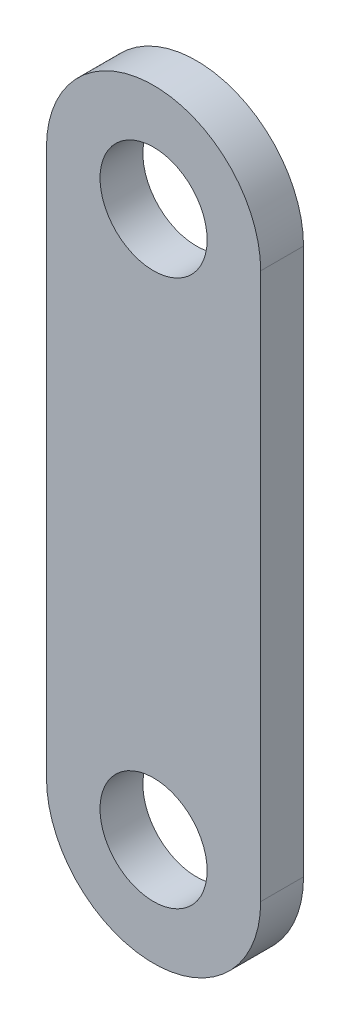
ISO-10303-21;
HEADER;
FILE_DESCRIPTION(('STEP AP214'),'2;1');
FILE_NAME('part.step','',(''),(''),'','','');
FILE_SCHEMA(('AUTOMOTIVE_DESIGN { 1 0 10303 214 1 1 1 1 }'));
ENDSEC;
DATA;
#1=APPLICATION_CONTEXT('core data for automotive mechanical design processes');
#2=APPLICATION_PROTOCOL_DEFINITION('international standard','automotive_design',2000,#1);
#3=PRODUCT_CONTEXT('',#1,'mechanical');
#4=PRODUCT('Part','Part','',(#3));
#5=PRODUCT_RELATED_PRODUCT_CATEGORY('part','',(#4));
#6=PRODUCT_DEFINITION_FORMATION('','',#4);
#7=PRODUCT_DEFINITION_CONTEXT('part definition',#1,'design');
#8=PRODUCT_DEFINITION('design','',#6,#7);
#9=PRODUCT_DEFINITION_SHAPE('','',#8);
#10=(LENGTH_UNIT() NAMED_UNIT(*) SI_UNIT(.MILLI.,.METRE.));
#11=(NAMED_UNIT(*) PLANE_ANGLE_UNIT() SI_UNIT($,.RADIAN.));
#12=(NAMED_UNIT(*) SI_UNIT($,.STERADIAN.) SOLID_ANGLE_UNIT());
#13=UNCERTAINTY_MEASURE_WITH_UNIT(LENGTH_MEASURE(1.E-05),#10,'distance_accuracy_value','');
#14=(GEOMETRIC_REPRESENTATION_CONTEXT(3) GLOBAL_UNCERTAINTY_ASSIGNED_CONTEXT((#13)) GLOBAL_UNIT_ASSIGNED_CONTEXT((#10,
#11,#12)) REPRESENTATION_CONTEXT('',''));
#15=CARTESIAN_POINT('',(0.,0.,0.));
#16=DIRECTION('',(0.,0.,1.));
#17=DIRECTION('',(1.,0.,0.));
#18=AXIS2_PLACEMENT_3D('',#15,#16,#17);
#19=CARTESIAN_POINT('',(-50.,0.,-10.));
#20=DIRECTION('',(1.,0.,0.));
#21=DIRECTION('',(0.,0.,-1.));
#22=AXIS2_PLACEMENT_3D('',#19,#20,#21);
#23=PLANE('',#22);
#24=DIRECTION('',(0.,0.,1.));
#25=VECTOR('',#24,1.);
#26=CARTESIAN_POINT('',(-50.,0.,-10.));
#27=LINE('',#26,#25);
#28=CARTESIAN_POINT('',(-50.,0.,-10.));
#29=VERTEX_POINT('',#28);
#30=CARTESIAN_POINT('',(-50.,0.,10.));
#31=VERTEX_POINT('',#30);
#32=EDGE_CURVE('E37',#29,#31,#27,.T.);
#33=ORIENTED_EDGE('',*,*,#32,.T.);
#34=DIRECTION('',(0.,1.,0.));
#35=VECTOR('',#34,1.);
#36=CARTESIAN_POINT('',(-50.,0.,10.));
#37=LINE('',#36,#35);
#38=CARTESIAN_POINT('',(-50.,255.,10.));
#39=VERTEX_POINT('',#38);
#40=EDGE_CURVE('E78',#31,#39,#37,.T.);
#41=ORIENTED_EDGE('',*,*,#40,.T.);
#42=DIRECTION('',(0.,0.,1.));
#43=VECTOR('',#42,1.);
#44=CARTESIAN_POINT('',(-50.,255.,-10.));
#45=LINE('',#44,#43);
#46=CARTESIAN_POINT('',(-50.,255.,-10.));
#47=VERTEX_POINT('',#46);
#48=EDGE_CURVE('E11',#47,#39,#45,.T.);
#49=ORIENTED_EDGE('',*,*,#48,.F.);
#50=DIRECTION('',(0.,1.,0.));
#51=VECTOR('',#50,1.);
#52=CARTESIAN_POINT('',(-50.,0.,-10.));
#53=LINE('',#52,#51);
#54=EDGE_CURVE('E50',#29,#47,#53,.T.);
#55=ORIENTED_EDGE('',*,*,#54,.F.);
#56=EDGE_LOOP('',(#33,#41,#49,#55));
#57=FACE_BOUND('',#56,.T.);
#58=ADVANCED_FACE('F33',(#57),#23,.F.);
#59=CARTESIAN_POINT('',(0.,255.,-10.));
#60=DIRECTION('',(0.,0.,1.));
#61=DIRECTION('',(1.,0.,0.));
#62=AXIS2_PLACEMENT_3D('',#59,#60,#61);
#63=CYLINDRICAL_SURFACE('',#62,50.);
#64=ORIENTED_EDGE('',*,*,#48,.T.);
#65=CARTESIAN_POINT('',(0.,255.,10.));
#66=DIRECTION('',(0.,0.,1.));
#67=DIRECTION('',(1.,0.,0.));
#68=AXIS2_PLACEMENT_3D('',#65,#66,#67);
#69=CIRCLE('',#68,50.);
#70=CARTESIAN_POINT('',(50.,255.,10.));
#71=VERTEX_POINT('',#70);
#72=EDGE_CURVE('E94',#71,#39,#69,.T.);
#73=ORIENTED_EDGE('',*,*,#72,.F.);
#74=DIRECTION('',(0.,0.,1.));
#75=VECTOR('',#74,1.);
#76=CARTESIAN_POINT('',(50.,255.,-10.));
#77=LINE('',#76,#75);
#78=CARTESIAN_POINT('',(50.,255.,-10.));
#79=VERTEX_POINT('',#78);
#80=EDGE_CURVE('E42',#79,#71,#77,.T.);
#81=ORIENTED_EDGE('',*,*,#80,.F.);
#82=CARTESIAN_POINT('',(0.,255.,-10.));
#83=DIRECTION('',(0.,0.,1.));
#84=DIRECTION('',(1.,0.,0.));
#85=AXIS2_PLACEMENT_3D('',#82,#83,#84);
#86=CIRCLE('',#85,50.);
#87=EDGE_CURVE('E82',#79,#47,#86,.T.);
#88=ORIENTED_EDGE('',*,*,#87,.T.);
#89=EDGE_LOOP('',(#64,#73,#81,#88));
#90=FACE_BOUND('',#89,.T.);
#91=ADVANCED_FACE('F118',(#90),#63,.T.);
#92=CARTESIAN_POINT('',(50.,0.,-10.));
#93=DIRECTION('',(-1.,0.,0.));
#94=DIRECTION('',(0.,0.,1.));
#95=AXIS2_PLACEMENT_3D('',#92,#93,#94);
#96=PLANE('',#95);
#97=ORIENTED_EDGE('',*,*,#80,.T.);
#98=DIRECTION('',(0.,-1.,0.));
#99=VECTOR('',#98,1.);
#100=CARTESIAN_POINT('',(50.,0.,10.));
#101=LINE('',#100,#99);
#102=CARTESIAN_POINT('',(50.,0.,10.));
#103=VERTEX_POINT('',#102);
#104=EDGE_CURVE('E90',#71,#103,#101,.T.);
#105=ORIENTED_EDGE('',*,*,#104,.T.);
#106=DIRECTION('',(0.,0.,1.));
#107=VECTOR('',#106,1.);
#108=CARTESIAN_POINT('',(50.,0.,-10.));
#109=LINE('',#108,#107);
#110=CARTESIAN_POINT('',(50.,0.,-10.));
#111=VERTEX_POINT('',#110);
#112=EDGE_CURVE('E81',#111,#103,#109,.T.);
#113=ORIENTED_EDGE('',*,*,#112,.F.);
#114=DIRECTION('',(0.,-1.,0.));
#115=VECTOR('',#114,1.);
#116=CARTESIAN_POINT('',(50.,0.,-10.));
#117=LINE('',#116,#115);
#118=EDGE_CURVE('E113',#79,#111,#117,.T.);
#119=ORIENTED_EDGE('',*,*,#118,.F.);
#120=EDGE_LOOP('',(#97,#105,#113,#119));
#121=FACE_BOUND('',#120,.T.);
#122=ADVANCED_FACE('F117',(#121),#96,.F.);
#123=CARTESIAN_POINT('',(0.,0.,-10.));
#124=DIRECTION('',(0.,0.,1.));
#125=DIRECTION('',(1.,0.,0.));
#126=AXIS2_PLACEMENT_3D('',#123,#124,#125);
#127=CYLINDRICAL_SURFACE('',#126,25.);
#128=CARTESIAN_POINT('',(0.,0.,-10.));
#129=DIRECTION('',(0.,0.,1.));
#130=DIRECTION('',(1.,0.,0.));
#131=AXIS2_PLACEMENT_3D('',#128,#129,#130);
#132=CIRCLE('',#131,25.);
#133=CARTESIAN_POINT('',(25.,0.,-10.));
#134=VERTEX_POINT('',#133);
#135=EDGE_CURVE('E107',#134,#134,#132,.T.);
#136=ORIENTED_EDGE('',*,*,#135,.F.);
#137=EDGE_LOOP('',(#136));
#138=FACE_BOUND('',#137,.T.);
#139=CARTESIAN_POINT('',(0.,0.,10.));
#140=DIRECTION('',(0.,0.,1.));
#141=DIRECTION('',(1.,0.,0.));
#142=AXIS2_PLACEMENT_3D('',#139,#140,#141);
#143=CIRCLE('',#142,25.);
#144=CARTESIAN_POINT('',(25.,0.,10.));
#145=VERTEX_POINT('',#144);
#146=EDGE_CURVE('E95',#145,#145,#143,.T.);
#147=ORIENTED_EDGE('',*,*,#146,.T.);
#148=EDGE_LOOP('',(#147));
#149=FACE_BOUND('',#148,.T.);
#150=ADVANCED_FACE('F138',(#138,#149),#127,.F.);
#151=CARTESIAN_POINT('',(0.,255.,-10.));
#152=DIRECTION('',(0.,0.,1.));
#153=DIRECTION('',(1.,0.,0.));
#154=AXIS2_PLACEMENT_3D('',#151,#152,#153);
#155=CYLINDRICAL_SURFACE('',#154,25.);
#156=CARTESIAN_POINT('',(0.,255.,-10.));
#157=DIRECTION('',(0.,0.,1.));
#158=DIRECTION('',(1.,0.,0.));
#159=AXIS2_PLACEMENT_3D('',#156,#157,#158);
#160=CIRCLE('',#159,25.);
#161=CARTESIAN_POINT('',(25.,255.,-10.));
#162=VERTEX_POINT('',#161);
#163=EDGE_CURVE('E104',#162,#162,#160,.T.);
#164=ORIENTED_EDGE('',*,*,#163,.F.);
#165=EDGE_LOOP('',(#164));
#166=FACE_BOUND('',#165,.T.);
#167=CARTESIAN_POINT('',(0.,255.,10.));
#168=DIRECTION('',(0.,0.,1.));
#169=DIRECTION('',(1.,0.,0.));
#170=AXIS2_PLACEMENT_3D('',#167,#168,#169);
#171=CIRCLE('',#170,25.);
#172=CARTESIAN_POINT('',(25.,255.,10.));
#173=VERTEX_POINT('',#172);
#174=EDGE_CURVE('E98',#173,#173,#171,.T.);
#175=ORIENTED_EDGE('',*,*,#174,.T.);
#176=EDGE_LOOP('',(#175));
#177=FACE_BOUND('',#176,.T.);
#178=ADVANCED_FACE('F35',(#166,#177),#155,.F.);
#179=CARTESIAN_POINT('',(0.,0.,-10.));
#180=DIRECTION('',(0.,0.,1.));
#181=DIRECTION('',(1.,0.,0.));
#182=AXIS2_PLACEMENT_3D('',#179,#180,#181);
#183=CYLINDRICAL_SURFACE('',#182,50.);
#184=ORIENTED_EDGE('',*,*,#112,.T.);
#185=CARTESIAN_POINT('',(0.,0.,10.));
#186=DIRECTION('',(0.,0.,1.));
#187=DIRECTION('',(1.,0.,0.));
#188=AXIS2_PLACEMENT_3D('',#185,#186,#187);
#189=CIRCLE('',#188,50.);
#190=EDGE_CURVE('E84',#31,#103,#189,.T.);
#191=ORIENTED_EDGE('',*,*,#190,.F.);
#192=ORIENTED_EDGE('',*,*,#32,.F.);
#193=CARTESIAN_POINT('',(0.,0.,-10.));
#194=DIRECTION('',(0.,0.,1.));
#195=DIRECTION('',(1.,0.,0.));
#196=AXIS2_PLACEMENT_3D('',#193,#194,#195);
#197=CIRCLE('',#196,50.);
#198=EDGE_CURVE('E111',#29,#111,#197,.T.);
#199=ORIENTED_EDGE('',*,*,#198,.T.);
#200=EDGE_LOOP('',(#184,#191,#192,#199));
#201=FACE_BOUND('',#200,.T.);
#202=ADVANCED_FACE('F85',(#201),#183,.T.);
#203=CARTESIAN_POINT('',(0.,0.,-10.));
#204=DIRECTION('',(0.,0.,1.));
#205=DIRECTION('',(1.,0.,0.));
#206=AXIS2_PLACEMENT_3D('',#203,#204,#205);
#207=PLANE('',#206);
#208=ORIENTED_EDGE('',*,*,#163,.T.);
#209=EDGE_LOOP('',(#208));
#210=FACE_BOUND('',#209,.T.);
#211=ORIENTED_EDGE('',*,*,#135,.T.);
#212=EDGE_LOOP('',(#211));
#213=FACE_BOUND('',#212,.T.);
#214=ORIENTED_EDGE('',*,*,#54,.T.);
#215=ORIENTED_EDGE('',*,*,#87,.F.);
#216=ORIENTED_EDGE('',*,*,#118,.T.);
#217=ORIENTED_EDGE('',*,*,#198,.F.);
#218=EDGE_LOOP('',(#214,#215,#216,#217));
#219=FACE_BOUND('',#218,.T.);
#220=ADVANCED_FACE('F119',(#210,#213,#219),#207,.F.);
#221=CARTESIAN_POINT('',(0.,0.,10.));
#222=DIRECTION('',(0.,0.,1.));
#223=DIRECTION('',(1.,0.,0.));
#224=AXIS2_PLACEMENT_3D('',#221,#222,#223);
#225=PLANE('',#224);
#226=ORIENTED_EDGE('',*,*,#174,.F.);
#227=EDGE_LOOP('',(#226));
#228=FACE_BOUND('',#227,.T.);
#229=ORIENTED_EDGE('',*,*,#146,.F.);
#230=EDGE_LOOP('',(#229));
#231=FACE_BOUND('',#230,.T.);
#232=ORIENTED_EDGE('',*,*,#40,.F.);
#233=ORIENTED_EDGE('',*,*,#190,.T.);
#234=ORIENTED_EDGE('',*,*,#104,.F.);
#235=ORIENTED_EDGE('',*,*,#72,.T.);
#236=EDGE_LOOP('',(#232,#233,#234,#235));
#237=FACE_BOUND('',#236,.T.);
#238=ADVANCED_FACE('F93',(#228,#231,#237),#225,.T.);
#239=CLOSED_SHELL('',(#58,#91,#122,#150,#178,#202,#220,#238));
#240=MANIFOLD_SOLID_BREP('B2',#239);
#241=ADVANCED_BREP_SHAPE_REPRESENTATION('',(#18,#240),#14);
#242=SHAPE_DEFINITION_REPRESENTATION(#9,#241);
ENDSEC;
END-ISO-10303-21;
